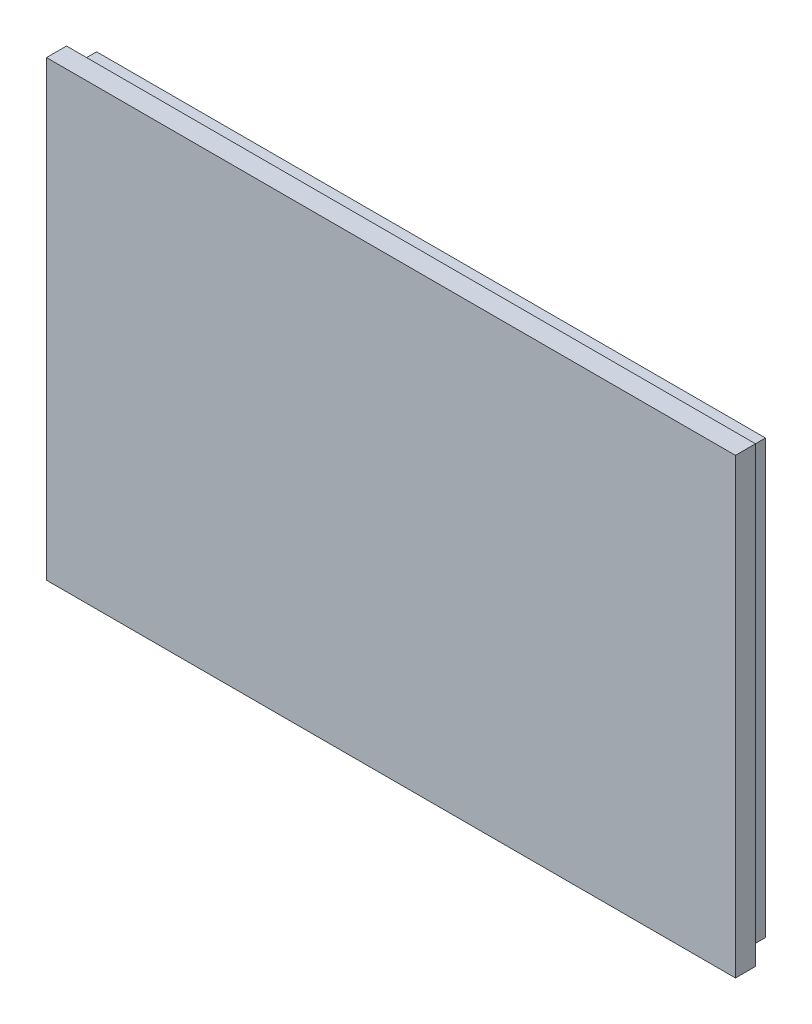
ISO-10303-21;
HEADER;
FILE_DESCRIPTION(('STEP AP214'),'2;1');
FILE_NAME('part.step','',(''),(''),'','','');
FILE_SCHEMA(('AUTOMOTIVE_DESIGN { 1 0 10303 214 1 1 1 1 }'));
ENDSEC;
DATA;
#1=APPLICATION_CONTEXT('core data for automotive mechanical design processes');
#2=APPLICATION_PROTOCOL_DEFINITION('international standard','automotive_design',2000,#1);
#3=PRODUCT_CONTEXT('',#1,'mechanical');
#4=PRODUCT('Part','Part','',(#3));
#5=PRODUCT_RELATED_PRODUCT_CATEGORY('part','',(#4));
#6=PRODUCT_DEFINITION_FORMATION('','',#4);
#7=PRODUCT_DEFINITION_CONTEXT('part definition',#1,'design');
#8=PRODUCT_DEFINITION('design','',#6,#7);
#9=PRODUCT_DEFINITION_SHAPE('','',#8);
#10=(LENGTH_UNIT() NAMED_UNIT(*) SI_UNIT(.MILLI.,.METRE.));
#11=(NAMED_UNIT(*) PLANE_ANGLE_UNIT() SI_UNIT($,.RADIAN.));
#12=(NAMED_UNIT(*) SI_UNIT($,.STERADIAN.) SOLID_ANGLE_UNIT());
#13=UNCERTAINTY_MEASURE_WITH_UNIT(LENGTH_MEASURE(1.E-05),#10,'distance_accuracy_value','');
#14=(GEOMETRIC_REPRESENTATION_CONTEXT(3) GLOBAL_UNCERTAINTY_ASSIGNED_CONTEXT((#13)) GLOBAL_UNIT_ASSIGNED_CONTEXT((#10,
#11,#12)) REPRESENTATION_CONTEXT('',''));
#15=CARTESIAN_POINT('',(0.,0.,0.));
#16=DIRECTION('',(0.,0.,1.));
#17=DIRECTION('',(1.,0.,0.));
#18=AXIS2_PLACEMENT_3D('',#15,#16,#17);
#19=CARTESIAN_POINT('',(17.2,-11.3,1.));
#20=DIRECTION('',(-1.,0.,0.));
#21=DIRECTION('',(0.,0.,1.));
#22=AXIS2_PLACEMENT_3D('',#19,#20,#21);
#23=PLANE('',#22);
#24=DIRECTION('',(0.,1.,0.));
#25=VECTOR('',#24,1.);
#26=CARTESIAN_POINT('',(17.2,-11.3,0.));
#27=LINE('',#26,#25);
#28=CARTESIAN_POINT('',(17.2,-11.3,0.));
#29=VERTEX_POINT('',#28);
#30=CARTESIAN_POINT('',(17.2,11.3,0.));
#31=VERTEX_POINT('',#30);
#32=EDGE_CURVE('E127',#29,#31,#27,.T.);
#33=ORIENTED_EDGE('',*,*,#32,.T.);
#34=DIRECTION('',(0.,0.,-1.));
#35=VECTOR('',#34,1.);
#36=CARTESIAN_POINT('',(17.2,11.3,1.));
#37=LINE('',#36,#35);
#38=CARTESIAN_POINT('',(17.2,11.3,1.));
#39=VERTEX_POINT('',#38);
#40=EDGE_CURVE('E11',#39,#31,#37,.T.);
#41=ORIENTED_EDGE('',*,*,#40,.F.);
#42=DIRECTION('',(0.,1.,0.));
#43=VECTOR('',#42,1.);
#44=CARTESIAN_POINT('',(17.2,-11.3,1.));
#45=LINE('',#44,#43);
#46=CARTESIAN_POINT('',(17.2,-11.3,1.));
#47=VERTEX_POINT('',#46);
#48=EDGE_CURVE('E138',#47,#39,#45,.T.);
#49=ORIENTED_EDGE('',*,*,#48,.F.);
#50=DIRECTION('',(0.,0.,-1.));
#51=VECTOR('',#50,1.);
#52=CARTESIAN_POINT('',(17.2,-11.3,1.));
#53=LINE('',#52,#51);
#54=EDGE_CURVE('E151',#47,#29,#53,.T.);
#55=ORIENTED_EDGE('',*,*,#54,.T.);
#56=EDGE_LOOP('',(#33,#41,#49,#55));
#57=FACE_BOUND('',#56,.T.);
#58=ADVANCED_FACE('F39',(#57),#23,.F.);
#59=CARTESIAN_POINT('',(-17.2,11.3,1.));
#60=DIRECTION('',(0.,-1.,0.));
#61=DIRECTION('',(0.,0.,-1.));
#62=AXIS2_PLACEMENT_3D('',#59,#60,#61);
#63=PLANE('',#62);
#64=DIRECTION('',(-1.,0.,0.));
#65=VECTOR('',#64,1.);
#66=CARTESIAN_POINT('',(-17.2,11.3,0.));
#67=LINE('',#66,#65);
#68=CARTESIAN_POINT('',(-17.2,11.3,0.));
#69=VERTEX_POINT('',#68);
#70=EDGE_CURVE('E132',#31,#69,#67,.T.);
#71=ORIENTED_EDGE('',*,*,#70,.T.);
#72=DIRECTION('',(0.,0.,-1.));
#73=VECTOR('',#72,1.);
#74=CARTESIAN_POINT('',(-17.2,11.3,1.));
#75=LINE('',#74,#73);
#76=CARTESIAN_POINT('',(-17.2,11.3,1.));
#77=VERTEX_POINT('',#76);
#78=EDGE_CURVE('E47',#77,#69,#75,.T.);
#79=ORIENTED_EDGE('',*,*,#78,.F.);
#80=DIRECTION('',(-1.,0.,0.));
#81=VECTOR('',#80,1.);
#82=CARTESIAN_POINT('',(-17.2,11.3,1.));
#83=LINE('',#82,#81);
#84=EDGE_CURVE('E142',#39,#77,#83,.T.);
#85=ORIENTED_EDGE('',*,*,#84,.F.);
#86=ORIENTED_EDGE('',*,*,#40,.T.);
#87=EDGE_LOOP('',(#71,#79,#85,#86));
#88=FACE_BOUND('',#87,.T.);
#89=ADVANCED_FACE('F188',(#88),#63,.F.);
#90=CARTESIAN_POINT('',(-17.2,-11.3,1.));
#91=DIRECTION('',(1.,0.,0.));
#92=DIRECTION('',(0.,0.,-1.));
#93=AXIS2_PLACEMENT_3D('',#90,#91,#92);
#94=PLANE('',#93);
#95=DIRECTION('',(0.,-1.,0.));
#96=VECTOR('',#95,1.);
#97=CARTESIAN_POINT('',(-17.2,-11.3,0.));
#98=LINE('',#97,#96);
#99=CARTESIAN_POINT('',(-17.2,-11.3,0.));
#100=VERTEX_POINT('',#99);
#101=EDGE_CURVE('E155',#69,#100,#98,.T.);
#102=ORIENTED_EDGE('',*,*,#101,.T.);
#103=DIRECTION('',(0.,0.,-1.));
#104=VECTOR('',#103,1.);
#105=CARTESIAN_POINT('',(-17.2,-11.3,1.));
#106=LINE('',#105,#104);
#107=CARTESIAN_POINT('',(-17.2,-11.3,1.));
#108=VERTEX_POINT('',#107);
#109=EDGE_CURVE('E163',#108,#100,#106,.T.);
#110=ORIENTED_EDGE('',*,*,#109,.F.);
#111=DIRECTION('',(0.,-1.,0.));
#112=VECTOR('',#111,1.);
#113=CARTESIAN_POINT('',(-17.2,-11.3,1.));
#114=LINE('',#113,#112);
#115=EDGE_CURVE('E146',#77,#108,#114,.T.);
#116=ORIENTED_EDGE('',*,*,#115,.F.);
#117=ORIENTED_EDGE('',*,*,#78,.T.);
#118=EDGE_LOOP('',(#102,#110,#116,#117));
#119=FACE_BOUND('',#118,.T.);
#120=ADVANCED_FACE('F172',(#119),#94,.F.);
#121=CARTESIAN_POINT('',(-17.2,-11.3,1.));
#122=DIRECTION('',(0.,1.,0.));
#123=DIRECTION('',(0.,0.,1.));
#124=AXIS2_PLACEMENT_3D('',#121,#122,#123);
#125=PLANE('',#124);
#126=DIRECTION('',(1.,0.,0.));
#127=VECTOR('',#126,1.);
#128=CARTESIAN_POINT('',(-17.2,-11.3,0.));
#129=LINE('',#128,#127);
#130=EDGE_CURVE('E143',#100,#29,#129,.T.);
#131=ORIENTED_EDGE('',*,*,#130,.T.);
#132=ORIENTED_EDGE('',*,*,#54,.F.);
#133=DIRECTION('',(1.,0.,0.));
#134=VECTOR('',#133,1.);
#135=CARTESIAN_POINT('',(-17.2,-11.3,1.));
#136=LINE('',#135,#134);
#137=EDGE_CURVE('E149',#108,#47,#136,.T.);
#138=ORIENTED_EDGE('',*,*,#137,.F.);
#139=ORIENTED_EDGE('',*,*,#109,.T.);
#140=EDGE_LOOP('',(#131,#132,#138,#139));
#141=FACE_BOUND('',#140,.T.);
#142=ADVANCED_FACE('F181',(#141),#125,.F.);
#143=CARTESIAN_POINT('',(0.,0.,1.));
#144=DIRECTION('',(0.,0.,-1.));
#145=DIRECTION('',(-1.,0.,0.));
#146=AXIS2_PLACEMENT_3D('',#143,#144,#145);
#147=PLANE('',#146);
#148=ORIENTED_EDGE('',*,*,#48,.T.);
#149=ORIENTED_EDGE('',*,*,#84,.T.);
#150=ORIENTED_EDGE('',*,*,#115,.T.);
#151=ORIENTED_EDGE('',*,*,#137,.T.);
#152=EDGE_LOOP('',(#148,#149,#150,#151));
#153=FACE_BOUND('',#152,.T.);
#154=ADVANCED_FACE('F187',(#153),#147,.F.);
#155=CARTESIAN_POINT('',(0.,0.,0.));
#156=DIRECTION('',(0.,0.,-1.));
#157=DIRECTION('',(-1.,0.,0.));
#158=AXIS2_PLACEMENT_3D('',#155,#156,#157);
#159=PLANE('',#158);
#160=DIRECTION('',(0.,1.,0.));
#161=VECTOR('',#160,1.);
#162=CARTESIAN_POINT('',(-16.7,-10.8,0.));
#163=LINE('',#162,#161);
#164=CARTESIAN_POINT('',(-16.7,-10.8,0.));
#165=VERTEX_POINT('',#164);
#166=CARTESIAN_POINT('',(-16.7,10.8,0.));
#167=VERTEX_POINT('',#166);
#168=EDGE_CURVE('E54',#165,#167,#163,.T.);
#169=ORIENTED_EDGE('',*,*,#168,.F.);
#170=DIRECTION('',(-1.,0.,0.));
#171=VECTOR('',#170,1.);
#172=CARTESIAN_POINT('',(16.7,-10.8,0.));
#173=LINE('',#172,#171);
#174=CARTESIAN_POINT('',(16.7,-10.8,0.));
#175=VERTEX_POINT('',#174);
#176=EDGE_CURVE('E58',#175,#165,#173,.T.);
#177=ORIENTED_EDGE('',*,*,#176,.F.);
#178=DIRECTION('',(0.,-1.,0.));
#179=VECTOR('',#178,1.);
#180=CARTESIAN_POINT('',(16.7,-10.8,0.));
#181=LINE('',#180,#179);
#182=CARTESIAN_POINT('',(16.7,10.8,0.));
#183=VERTEX_POINT('',#182);
#184=EDGE_CURVE('E283',#183,#175,#181,.T.);
#185=ORIENTED_EDGE('',*,*,#184,.F.);
#186=DIRECTION('',(1.,0.,0.));
#187=VECTOR('',#186,1.);
#188=CARTESIAN_POINT('',(16.7,10.8,0.));
#189=LINE('',#188,#187);
#190=EDGE_CURVE('E293',#167,#183,#189,.T.);
#191=ORIENTED_EDGE('',*,*,#190,.F.);
#192=EDGE_LOOP('',(#169,#177,#185,#191));
#193=FACE_BOUND('',#192,.T.);
#194=ORIENTED_EDGE('',*,*,#32,.F.);
#195=ORIENTED_EDGE('',*,*,#130,.F.);
#196=ORIENTED_EDGE('',*,*,#101,.F.);
#197=ORIENTED_EDGE('',*,*,#70,.F.);
#198=EDGE_LOOP('',(#194,#195,#196,#197));
#199=FACE_BOUND('',#198,.T.);
#200=ADVANCED_FACE('F178',(#193,#199),#159,.T.);
#201=CARTESIAN_POINT('',(-16.7,-10.8,-1.));
#202=DIRECTION('',(1.,0.,0.));
#203=DIRECTION('',(0.,0.,-1.));
#204=AXIS2_PLACEMENT_3D('',#201,#202,#203);
#205=PLANE('',#204);
#206=ORIENTED_EDGE('',*,*,#168,.T.);
#207=DIRECTION('',(0.,0.,1.));
#208=VECTOR('',#207,1.);
#209=CARTESIAN_POINT('',(-16.7,10.8,-1.));
#210=LINE('',#209,#208);
#211=CARTESIAN_POINT('',(-16.7,10.8,-1.));
#212=VERTEX_POINT('',#211);
#213=EDGE_CURVE('E107',#212,#167,#210,.T.);
#214=ORIENTED_EDGE('',*,*,#213,.F.);
#215=DIRECTION('',(0.,1.,0.));
#216=VECTOR('',#215,1.);
#217=CARTESIAN_POINT('',(-16.7,-10.8,-1.));
#218=LINE('',#217,#216);
#219=CARTESIAN_POINT('',(-16.7,-10.8,-1.));
#220=VERTEX_POINT('',#219);
#221=EDGE_CURVE('E114',#220,#212,#218,.T.);
#222=ORIENTED_EDGE('',*,*,#221,.F.);
#223=DIRECTION('',(0.,0.,1.));
#224=VECTOR('',#223,1.);
#225=CARTESIAN_POINT('',(-16.7,-10.8,-1.));
#226=LINE('',#225,#224);
#227=EDGE_CURVE('E280',#220,#165,#226,.T.);
#228=ORIENTED_EDGE('',*,*,#227,.T.);
#229=EDGE_LOOP('',(#206,#214,#222,#228));
#230=FACE_BOUND('',#229,.T.);
#231=ADVANCED_FACE('F125',(#230),#205,.F.);
#232=CARTESIAN_POINT('',(16.7,10.8,-1.));
#233=DIRECTION('',(0.,-1.,0.));
#234=DIRECTION('',(0.,0.,-1.));
#235=AXIS2_PLACEMENT_3D('',#232,#233,#234);
#236=PLANE('',#235);
#237=ORIENTED_EDGE('',*,*,#190,.T.);
#238=DIRECTION('',(0.,0.,1.));
#239=VECTOR('',#238,1.);
#240=CARTESIAN_POINT('',(16.7,10.8,-1.));
#241=LINE('',#240,#239);
#242=CARTESIAN_POINT('',(16.7,10.8,-1.));
#243=VERTEX_POINT('',#242);
#244=EDGE_CURVE('E109',#243,#183,#241,.T.);
#245=ORIENTED_EDGE('',*,*,#244,.F.);
#246=DIRECTION('',(1.,0.,0.));
#247=VECTOR('',#246,1.);
#248=CARTESIAN_POINT('',(16.7,10.8,-1.));
#249=LINE('',#248,#247);
#250=EDGE_CURVE('E102',#212,#243,#249,.T.);
#251=ORIENTED_EDGE('',*,*,#250,.F.);
#252=ORIENTED_EDGE('',*,*,#213,.T.);
#253=EDGE_LOOP('',(#237,#245,#251,#252));
#254=FACE_BOUND('',#253,.T.);
#255=ADVANCED_FACE('F105',(#254),#236,.F.);
#256=CARTESIAN_POINT('',(16.7,-10.8,-1.));
#257=DIRECTION('',(-1.,0.,0.));
#258=DIRECTION('',(0.,0.,1.));
#259=AXIS2_PLACEMENT_3D('',#256,#257,#258);
#260=PLANE('',#259);
#261=ORIENTED_EDGE('',*,*,#184,.T.);
#262=DIRECTION('',(0.,0.,1.));
#263=VECTOR('',#262,1.);
#264=CARTESIAN_POINT('',(16.7,-10.8,-1.));
#265=LINE('',#264,#263);
#266=CARTESIAN_POINT('',(16.7,-10.8,-1.));
#267=VERTEX_POINT('',#266);
#268=EDGE_CURVE('E134',#267,#175,#265,.T.);
#269=ORIENTED_EDGE('',*,*,#268,.F.);
#270=DIRECTION('',(0.,-1.,0.));
#271=VECTOR('',#270,1.);
#272=CARTESIAN_POINT('',(16.7,-10.8,-1.));
#273=LINE('',#272,#271);
#274=EDGE_CURVE('E113',#243,#267,#273,.T.);
#275=ORIENTED_EDGE('',*,*,#274,.F.);
#276=ORIENTED_EDGE('',*,*,#244,.T.);
#277=EDGE_LOOP('',(#261,#269,#275,#276));
#278=FACE_BOUND('',#277,.T.);
#279=ADVANCED_FACE('F206',(#278),#260,.F.);
#280=CARTESIAN_POINT('',(16.7,-10.8,-1.));
#281=DIRECTION('',(0.,1.,0.));
#282=DIRECTION('',(0.,0.,1.));
#283=AXIS2_PLACEMENT_3D('',#280,#281,#282);
#284=PLANE('',#283);
#285=ORIENTED_EDGE('',*,*,#176,.T.);
#286=ORIENTED_EDGE('',*,*,#227,.F.);
#287=DIRECTION('',(-1.,0.,0.));
#288=VECTOR('',#287,1.);
#289=CARTESIAN_POINT('',(16.7,-10.8,-1.));
#290=LINE('',#289,#288);
#291=EDGE_CURVE('E119',#267,#220,#290,.T.);
#292=ORIENTED_EDGE('',*,*,#291,.F.);
#293=ORIENTED_EDGE('',*,*,#268,.T.);
#294=EDGE_LOOP('',(#285,#286,#292,#293));
#295=FACE_BOUND('',#294,.T.);
#296=ADVANCED_FACE('F209',(#295),#284,.F.);
#297=CARTESIAN_POINT('',(0.,0.,-1.));
#298=DIRECTION('',(0.,0.,1.));
#299=DIRECTION('',(1.,0.,0.));
#300=AXIS2_PLACEMENT_3D('',#297,#298,#299);
#301=PLANE('',#300);
#302=ORIENTED_EDGE('',*,*,#221,.T.);
#303=ORIENTED_EDGE('',*,*,#250,.T.);
#304=ORIENTED_EDGE('',*,*,#274,.T.);
#305=ORIENTED_EDGE('',*,*,#291,.T.);
#306=EDGE_LOOP('',(#302,#303,#304,#305));
#307=FACE_BOUND('',#306,.T.);
#308=ADVANCED_FACE('F117',(#307),#301,.F.);
#309=CLOSED_SHELL('',(#58,#89,#120,#142,#154,#200,#231,#255,#279,#296,#308));
#310=MANIFOLD_SOLID_BREP('B2',#309);
#311=ADVANCED_BREP_SHAPE_REPRESENTATION('',(#18,#310),#14);
#312=SHAPE_DEFINITION_REPRESENTATION(#9,#311);
ENDSEC;
END-ISO-10303-21;
